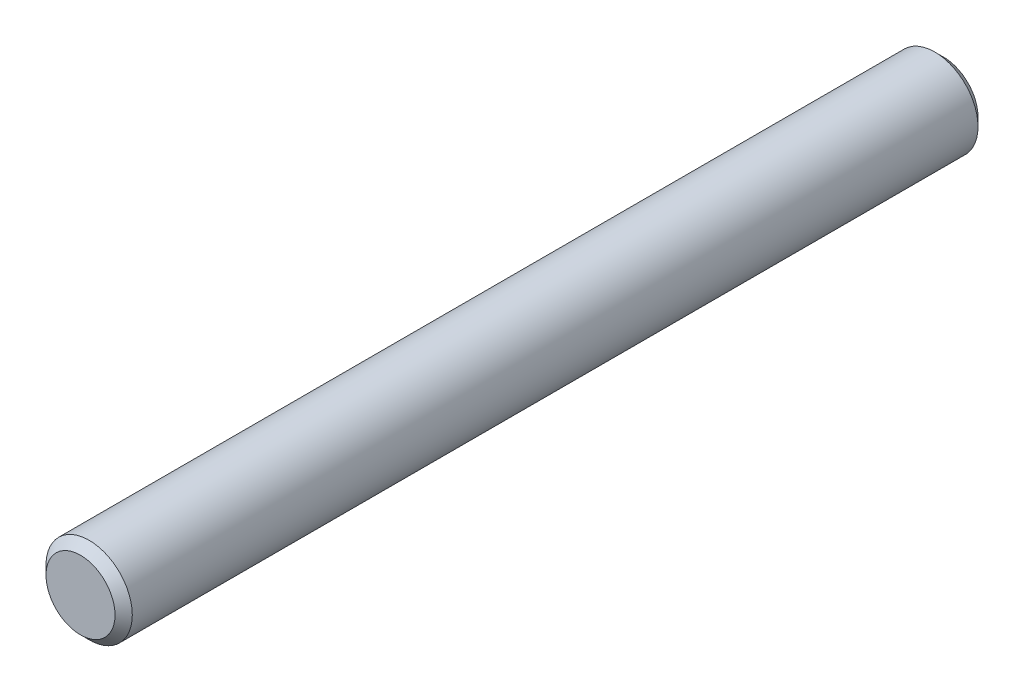
ISO-10303-21;
HEADER;
FILE_DESCRIPTION(('STEP AP214'),'2;1');
FILE_NAME('part.step','',(''),(''),'','','');
FILE_SCHEMA(('AUTOMOTIVE_DESIGN { 1 0 10303 214 1 1 1 1 }'));
ENDSEC;
DATA;
#1=APPLICATION_CONTEXT('core data for automotive mechanical design processes');
#2=APPLICATION_PROTOCOL_DEFINITION('international standard','automotive_design',2000,#1);
#3=PRODUCT_CONTEXT('',#1,'mechanical');
#4=PRODUCT('Part','Part','',(#3));
#5=PRODUCT_RELATED_PRODUCT_CATEGORY('part','',(#4));
#6=PRODUCT_DEFINITION_FORMATION('','',#4);
#7=PRODUCT_DEFINITION_CONTEXT('part definition',#1,'design');
#8=PRODUCT_DEFINITION('design','',#6,#7);
#9=PRODUCT_DEFINITION_SHAPE('','',#8);
#10=(LENGTH_UNIT() NAMED_UNIT(*) SI_UNIT(.MILLI.,.METRE.));
#11=(NAMED_UNIT(*) PLANE_ANGLE_UNIT() SI_UNIT($,.RADIAN.));
#12=(NAMED_UNIT(*) SI_UNIT($,.STERADIAN.) SOLID_ANGLE_UNIT());
#13=UNCERTAINTY_MEASURE_WITH_UNIT(LENGTH_MEASURE(1.E-05),#10,'distance_accuracy_value','');
#14=(GEOMETRIC_REPRESENTATION_CONTEXT(3) GLOBAL_UNCERTAINTY_ASSIGNED_CONTEXT((#13)) GLOBAL_UNIT_ASSIGNED_CONTEXT((#10,
#11,#12)) REPRESENTATION_CONTEXT('',''));
#15=CARTESIAN_POINT('',(0.,0.,0.));
#16=DIRECTION('',(0.,0.,1.));
#17=DIRECTION('',(1.,0.,0.));
#18=AXIS2_PLACEMENT_3D('',#15,#16,#17);
#19=CARTESIAN_POINT('',(0.,0.,50.));
#20=DIRECTION('',(0.,0.,-1.));
#21=DIRECTION('',(-1.,0.,0.));
#22=AXIS2_PLACEMENT_3D('',#19,#20,#21);
#23=CYLINDRICAL_SURFACE('',#22,2.5);
#24=CARTESIAN_POINT('',(0.,0.,0.500000000000007));
#25=DIRECTION('',(0.,0.,1.));
#26=DIRECTION('',(1.,0.,0.));
#27=AXIS2_PLACEMENT_3D('',#24,#25,#26);
#28=CIRCLE('',#27,2.5);
#29=CARTESIAN_POINT('',(2.5,0.,0.500000000000007));
#30=VERTEX_POINT('',#29);
#31=EDGE_CURVE('E66',#30,#30,#28,.T.);
#32=ORIENTED_EDGE('',*,*,#31,.T.);
#33=EDGE_LOOP('',(#32));
#34=FACE_BOUND('',#33,.T.);
#35=CARTESIAN_POINT('',(0.,0.,49.5));
#36=DIRECTION('',(0.,0.,1.));
#37=DIRECTION('',(1.,0.,0.));
#38=AXIS2_PLACEMENT_3D('',#35,#36,#37);
#39=CIRCLE('',#38,2.5);
#40=CARTESIAN_POINT('',(2.5,0.,49.5));
#41=VERTEX_POINT('',#40);
#42=EDGE_CURVE('E72',#41,#41,#39,.F.);
#43=ORIENTED_EDGE('',*,*,#42,.T.);
#44=EDGE_LOOP('',(#43));
#45=FACE_BOUND('',#44,.T.);
#46=ADVANCED_FACE('F50',(#34,#45),#23,.T.);
#47=CARTESIAN_POINT('',(0.,0.,50.));
#48=DIRECTION('',(0.,0.,1.));
#49=DIRECTION('',(1.,0.,0.));
#50=AXIS2_PLACEMENT_3D('',#47,#48,#49);
#51=PLANE('',#50);
#52=CARTESIAN_POINT('',(0.,0.,50.));
#53=DIRECTION('',(0.,0.,1.));
#54=DIRECTION('',(1.,0.,0.));
#55=AXIS2_PLACEMENT_3D('',#52,#53,#54);
#56=CIRCLE('',#55,2.);
#57=CARTESIAN_POINT('',(2.,0.,50.));
#58=VERTEX_POINT('',#57);
#59=EDGE_CURVE('E12',#58,#58,#56,.T.);
#60=ORIENTED_EDGE('',*,*,#59,.T.);
#61=EDGE_LOOP('',(#60));
#62=FACE_BOUND('',#61,.T.);
#63=ADVANCED_FACE('F89',(#62),#51,.T.);
#64=CARTESIAN_POINT('',(0.,0.,0.));
#65=DIRECTION('',(0.,0.,1.));
#66=DIRECTION('',(1.,0.,0.));
#67=AXIS2_PLACEMENT_3D('',#64,#65,#66);
#68=PLANE('',#67);
#69=CARTESIAN_POINT('',(0.,0.,0.));
#70=DIRECTION('',(0.,0.,1.));
#71=DIRECTION('',(1.,0.,0.));
#72=AXIS2_PLACEMENT_3D('',#69,#70,#71);
#73=CIRCLE('',#72,1.99999999999999);
#74=CARTESIAN_POINT('',(1.99999999999999,0.,0.));
#75=VERTEX_POINT('',#74);
#76=EDGE_CURVE('E59',#75,#75,#73,.F.);
#77=ORIENTED_EDGE('',*,*,#76,.T.);
#78=EDGE_LOOP('',(#77));
#79=FACE_BOUND('',#78,.T.);
#80=ADVANCED_FACE('F86',(#79),#68,.F.);
#81=CARTESIAN_POINT('',(0.,0.,0.500000000000007));
#82=DIRECTION('',(0.,0.,1.));
#83=DIRECTION('',(1.,0.,0.));
#84=AXIS2_PLACEMENT_3D('',#81,#82,#83);
#85=CONICAL_SURFACE('',#84,2.5,0.785398163397453);
#86=ORIENTED_EDGE('',*,*,#76,.F.);
#87=EDGE_LOOP('',(#86));
#88=FACE_BOUND('',#87,.T.);
#89=ORIENTED_EDGE('',*,*,#31,.F.);
#90=EDGE_LOOP('',(#89));
#91=FACE_BOUND('',#90,.T.);
#92=ADVANCED_FACE('F82',(#88,#91),#85,.T.);
#93=CARTESIAN_POINT('',(0.,0.,50.));
#94=DIRECTION('',(0.,0.,-1.));
#95=DIRECTION('',(-1.,0.,0.));
#96=AXIS2_PLACEMENT_3D('',#93,#94,#95);
#97=CONICAL_SURFACE('',#96,2.,0.785398163397446);
#98=ORIENTED_EDGE('',*,*,#42,.F.);
#99=EDGE_LOOP('',(#98));
#100=FACE_BOUND('',#99,.T.);
#101=ORIENTED_EDGE('',*,*,#59,.F.);
#102=EDGE_LOOP('',(#101));
#103=FACE_BOUND('',#102,.T.);
#104=ADVANCED_FACE('F53',(#100,#103),#97,.T.);
#105=CLOSED_SHELL('',(#46,#63,#80,#92,#104));
#106=MANIFOLD_SOLID_BREP('B2',#105);
#107=ADVANCED_BREP_SHAPE_REPRESENTATION('',(#18,#106),#14);
#108=SHAPE_DEFINITION_REPRESENTATION(#9,#107);
ENDSEC;
END-ISO-10303-21;
